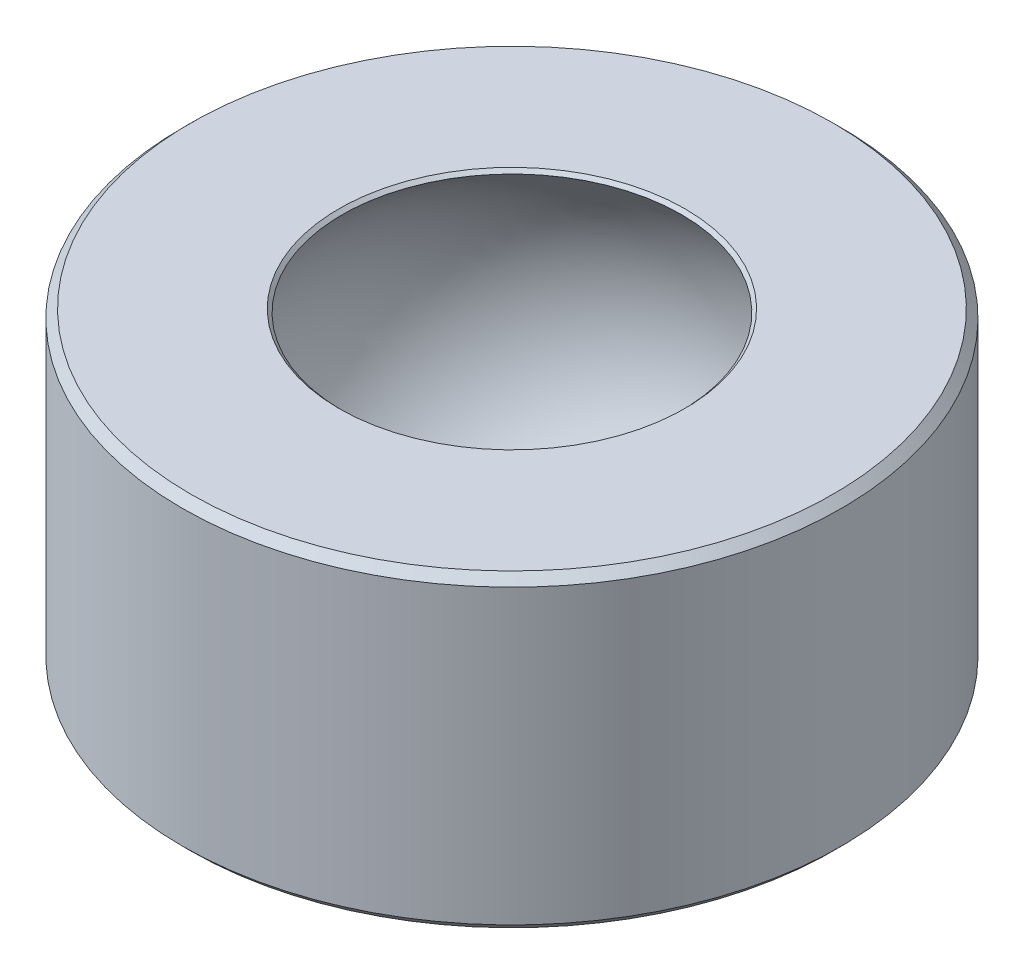
ISO-10303-21;
HEADER;
FILE_DESCRIPTION(('STEP AP214'),'2;1');
FILE_NAME('part.step','',(''),(''),'','','');
FILE_SCHEMA(('AUTOMOTIVE_DESIGN { 1 0 10303 214 1 1 1 1 }'));
ENDSEC;
DATA;
#1=APPLICATION_CONTEXT('core data for automotive mechanical design processes');
#2=APPLICATION_PROTOCOL_DEFINITION('international standard','automotive_design',2000,#1);
#3=PRODUCT_CONTEXT('',#1,'mechanical');
#4=PRODUCT('Part','Part','',(#3));
#5=PRODUCT_RELATED_PRODUCT_CATEGORY('part','',(#4));
#6=PRODUCT_DEFINITION_FORMATION('','',#4);
#7=PRODUCT_DEFINITION_CONTEXT('part definition',#1,'design');
#8=PRODUCT_DEFINITION('design','',#6,#7);
#9=PRODUCT_DEFINITION_SHAPE('','',#8);
#10=(LENGTH_UNIT() NAMED_UNIT(*) SI_UNIT(.MILLI.,.METRE.));
#11=(NAMED_UNIT(*) PLANE_ANGLE_UNIT() SI_UNIT($,.RADIAN.));
#12=(NAMED_UNIT(*) SI_UNIT($,.STERADIAN.) SOLID_ANGLE_UNIT());
#13=UNCERTAINTY_MEASURE_WITH_UNIT(LENGTH_MEASURE(1.E-05),#10,'distance_accuracy_value','');
#14=(GEOMETRIC_REPRESENTATION_CONTEXT(3) GLOBAL_UNCERTAINTY_ASSIGNED_CONTEXT((#13)) GLOBAL_UNIT_ASSIGNED_CONTEXT((#10,
#11,#12)) REPRESENTATION_CONTEXT('',''));
#15=CARTESIAN_POINT('',(0.,0.,0.));
#16=DIRECTION('',(0.,0.,1.));
#17=DIRECTION('',(1.,0.,0.));
#18=AXIS2_PLACEMENT_3D('',#15,#16,#17);
#19=CARTESIAN_POINT('',(0.,-1.875,0.));
#20=DIRECTION('',(0.,1.,0.));
#21=DIRECTION('',(0.,0.,1.));
#22=AXIS2_PLACEMENT_3D('',#19,#20,#21);
#23=CYLINDRICAL_SURFACE('',#22,4.);
#24=CARTESIAN_POINT('',(0.,1.775,0.));
#25=DIRECTION('',(0.,1.,0.));
#26=DIRECTION('',(0.,0.,1.));
#27=AXIS2_PLACEMENT_3D('',#24,#25,#26);
#28=CIRCLE('',#27,4.);
#29=CARTESIAN_POINT('',(0.,1.775,4.));
#30=VERTEX_POINT('',#29);
#31=EDGE_CURVE('E70',#30,#30,#28,.F.);
#32=ORIENTED_EDGE('',*,*,#31,.T.);
#33=EDGE_LOOP('',(#32));
#34=FACE_BOUND('',#33,.T.);
#35=CARTESIAN_POINT('',(0.,-1.775,0.));
#36=DIRECTION('',(0.,1.,0.));
#37=DIRECTION('',(0.,0.,1.));
#38=AXIS2_PLACEMENT_3D('',#35,#36,#37);
#39=CIRCLE('',#38,4.);
#40=CARTESIAN_POINT('',(0.,-1.775,4.));
#41=VERTEX_POINT('',#40);
#42=EDGE_CURVE('E74',#41,#41,#39,.T.);
#43=ORIENTED_EDGE('',*,*,#42,.T.);
#44=EDGE_LOOP('',(#43));
#45=FACE_BOUND('',#44,.T.);
#46=ADVANCED_FACE('F45',(#34,#45),#23,.T.);
#47=CARTESIAN_POINT('',(0.,-1.875,0.));
#48=DIRECTION('',(0.,1.,0.));
#49=DIRECTION('',(0.,0.,1.));
#50=AXIS2_PLACEMENT_3D('',#47,#48,#49);
#51=PLANE('',#50);
#52=CARTESIAN_POINT('',(0.,-1.875,0.));
#53=DIRECTION('',(0.,1.,0.));
#54=DIRECTION('',(0.,0.,1.));
#55=AXIS2_PLACEMENT_3D('',#52,#53,#54);
#56=CIRCLE('',#55,3.9);
#57=CARTESIAN_POINT('',(0.,-1.875,3.9));
#58=VERTEX_POINT('',#57);
#59=EDGE_CURVE('E59',#58,#58,#56,.F.);
#60=ORIENTED_EDGE('',*,*,#59,.T.);
#61=EDGE_LOOP('',(#60));
#62=FACE_BOUND('',#61,.T.);
#63=CARTESIAN_POINT('',(0.,-1.875,0.));
#64=DIRECTION('',(0.,1.,0.));
#65=DIRECTION('',(0.,0.,1.));
#66=AXIS2_PLACEMENT_3D('',#63,#64,#65);
#67=CIRCLE('',#66,2.07206982543642);
#68=CARTESIAN_POINT('',(0.,-1.875,2.07206982543642));
#69=VERTEX_POINT('',#68);
#70=EDGE_CURVE('E64',#69,#69,#67,.T.);
#71=ORIENTED_EDGE('',*,*,#70,.T.);
#72=EDGE_LOOP('',(#71));
#73=FACE_BOUND('',#72,.T.);
#74=ADVANCED_FACE('F103',(#62,#73),#51,.F.);
#75=CARTESIAN_POINT('',(0.,1.875,0.));
#76=DIRECTION('',(0.,1.,0.));
#77=DIRECTION('',(0.,0.,1.));
#78=AXIS2_PLACEMENT_3D('',#75,#76,#77);
#79=PLANE('',#78);
#80=CARTESIAN_POINT('',(0.,1.875,0.));
#81=DIRECTION('',(0.,1.,0.));
#82=DIRECTION('',(0.,0.,1.));
#83=AXIS2_PLACEMENT_3D('',#80,#81,#82);
#84=CIRCLE('',#83,3.9);
#85=CARTESIAN_POINT('',(0.,1.875,3.9));
#86=VERTEX_POINT('',#85);
#87=EDGE_CURVE('E78',#86,#86,#84,.T.);
#88=ORIENTED_EDGE('',*,*,#87,.T.);
#89=EDGE_LOOP('',(#88));
#90=FACE_BOUND('',#89,.T.);
#91=CARTESIAN_POINT('',(0.,1.875,0.));
#92=DIRECTION('',(0.,1.,0.));
#93=DIRECTION('',(0.,0.,1.));
#94=AXIS2_PLACEMENT_3D('',#91,#92,#93);
#95=CIRCLE('',#94,2.1);
#96=CARTESIAN_POINT('',(0.,1.875,2.1));
#97=VERTEX_POINT('',#96);
#98=EDGE_CURVE('E82',#97,#97,#95,.F.);
#99=ORIENTED_EDGE('',*,*,#98,.T.);
#100=EDGE_LOOP('',(#99));
#101=FACE_BOUND('',#100,.T.);
#102=ADVANCED_FACE('F87',(#90,#101),#79,.T.);
#103=CARTESIAN_POINT('',(0.,0.,0.));
#104=DIRECTION('',(0.,1.,0.));
#105=DIRECTION('',(0.,0.,1.));
#106=AXIS2_PLACEMENT_3D('',#103,#104,#105);
#107=DEGENERATE_TOROIDAL_SURFACE('',#106,0.7421875,2.2578125,.T.);
#108=CARTESIAN_POINT('',(0.,1.83402636202727,0.));
#109=DIRECTION('',(0.,-1.,0.));
#110=DIRECTION('',(0.,0.,-1.));
#111=AXIS2_PLACEMENT_3D('',#108,#109,#110);
#112=CIRCLE('',#111,2.05902636202727);
#113=CARTESIAN_POINT('',(0.,1.83402636202727,-2.05902636202727));
#114=VERTEX_POINT('',#113);
#115=EDGE_CURVE('E10',#114,#114,#112,.F.);
#116=ORIENTED_EDGE('',*,*,#115,.T.);
#117=EDGE_LOOP('',(#116));
#118=FACE_BOUND('',#117,.T.);
#119=CARTESIAN_POINT('',(0.,-1.8160720356382,0.));
#120=DIRECTION('',(0.,1.,0.));
#121=DIRECTION('',(0.,0.,1.));
#122=AXIS2_PLACEMENT_3D('',#119,#120,#121);
#123=CIRCLE('',#122,2.08367907527327);
#124=CARTESIAN_POINT('',(0.,-1.8160720356382,2.08367907527327));
#125=VERTEX_POINT('',#124);
#126=EDGE_CURVE('E54',#125,#125,#123,.F.);
#127=ORIENTED_EDGE('',*,*,#126,.T.);
#128=EDGE_LOOP('',(#127));
#129=FACE_BOUND('',#128,.T.);
#130=ADVANCED_FACE('F119',(#118,#129),#107,.F.);
#131=CARTESIAN_POINT('',(0.,1.875,0.));
#132=DIRECTION('',(0.,-1.,0.));
#133=DIRECTION('',(0.,0.,-1.));
#134=AXIS2_PLACEMENT_3D('',#131,#132,#133);
#135=CONICAL_SURFACE('',#134,3.9,0.785398163397448);
#136=ORIENTED_EDGE('',*,*,#31,.F.);
#137=EDGE_LOOP('',(#136));
#138=FACE_BOUND('',#137,.T.);
#139=ORIENTED_EDGE('',*,*,#87,.F.);
#140=EDGE_LOOP('',(#139));
#141=FACE_BOUND('',#140,.T.);
#142=ADVANCED_FACE('F98',(#138,#141),#135,.T.);
#143=CARTESIAN_POINT('',(0.,-1.775,0.));
#144=DIRECTION('',(0.,1.,0.));
#145=DIRECTION('',(0.,0.,1.));
#146=AXIS2_PLACEMENT_3D('',#143,#144,#145);
#147=CONICAL_SURFACE('',#146,4.,0.785398163397453);
#148=ORIENTED_EDGE('',*,*,#59,.F.);
#149=EDGE_LOOP('',(#148));
#150=FACE_BOUND('',#149,.T.);
#151=ORIENTED_EDGE('',*,*,#42,.F.);
#152=EDGE_LOOP('',(#151));
#153=FACE_BOUND('',#152,.T.);
#154=ADVANCED_FACE('F92',(#150,#153),#147,.T.);
#155=CARTESIAN_POINT('',(0.,1.83402636202727,0.));
#156=DIRECTION('',(0.,1.,0.));
#157=DIRECTION('',(0.,0.,1.));
#158=AXIS2_PLACEMENT_3D('',#155,#156,#157);
#159=CONICAL_SURFACE('',#158,2.05902636202727,0.785398163397456);
#160=ORIENTED_EDGE('',*,*,#98,.F.);
#161=EDGE_LOOP('',(#160));
#162=FACE_BOUND('',#161,.T.);
#163=ORIENTED_EDGE('',*,*,#115,.F.);
#164=EDGE_LOOP('',(#163));
#165=FACE_BOUND('',#164,.T.);
#166=ADVANCED_FACE('F89',(#162,#165),#159,.F.);
#167=CARTESIAN_POINT('',(0.,-1.875,0.));
#168=DIRECTION('',(0.,1.,0.));
#169=DIRECTION('',(0.,0.,1.));
#170=AXIS2_PLACEMENT_3D('',#167,#168,#169);
#171=CONICAL_SURFACE('',#170,2.07206982543642,0.194516489109807);
#172=ORIENTED_EDGE('',*,*,#126,.F.);
#173=EDGE_LOOP('',(#172));
#174=FACE_BOUND('',#173,.T.);
#175=ORIENTED_EDGE('',*,*,#70,.F.);
#176=EDGE_LOOP('',(#175));
#177=FACE_BOUND('',#176,.T.);
#178=ADVANCED_FACE('F48',(#174,#177),#171,.F.);
#179=CLOSED_SHELL('',(#46,#74,#102,#130,#142,#154,#166,#178));
#180=MANIFOLD_SOLID_BREP('B2',#179);
#181=ADVANCED_BREP_SHAPE_REPRESENTATION('',(#18,#180),#14);
#182=SHAPE_DEFINITION_REPRESENTATION(#9,#181);
ENDSEC;
END-ISO-10303-21;
